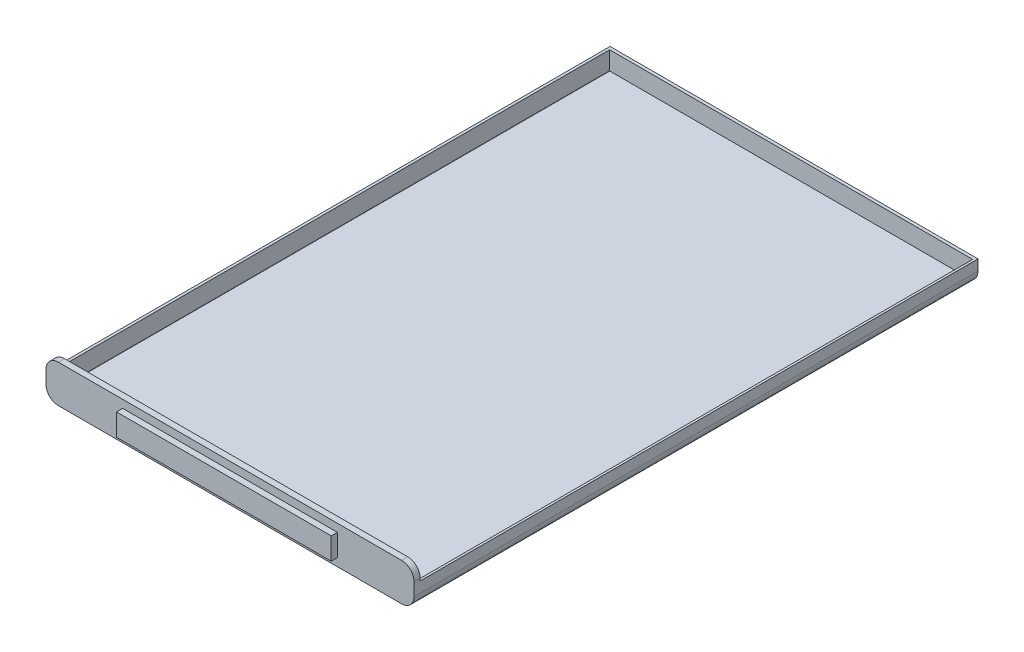
ISO-10303-21;
HEADER;
FILE_DESCRIPTION(('STEP AP214'),'2;1');
FILE_NAME('part.step','',(''),(''),'','','');
FILE_SCHEMA(('AUTOMOTIVE_DESIGN { 1 0 10303 214 1 1 1 1 }'));
ENDSEC;
DATA;
#1=APPLICATION_CONTEXT('core data for automotive mechanical design processes');
#2=APPLICATION_PROTOCOL_DEFINITION('international standard','automotive_design',2000,#1);
#3=PRODUCT_CONTEXT('',#1,'mechanical');
#4=PRODUCT('Part','Part','',(#3));
#5=PRODUCT_RELATED_PRODUCT_CATEGORY('part','',(#4));
#6=PRODUCT_DEFINITION_FORMATION('','',#4);
#7=PRODUCT_DEFINITION_CONTEXT('part definition',#1,'design');
#8=PRODUCT_DEFINITION('design','',#6,#7);
#9=PRODUCT_DEFINITION_SHAPE('','',#8);
#10=(LENGTH_UNIT() NAMED_UNIT(*) SI_UNIT(.MILLI.,.METRE.));
#11=(NAMED_UNIT(*) PLANE_ANGLE_UNIT() SI_UNIT($,.RADIAN.));
#12=(NAMED_UNIT(*) SI_UNIT($,.STERADIAN.) SOLID_ANGLE_UNIT());
#13=UNCERTAINTY_MEASURE_WITH_UNIT(LENGTH_MEASURE(1.E-05),#10,'distance_accuracy_value','');
#14=(GEOMETRIC_REPRESENTATION_CONTEXT(3) GLOBAL_UNCERTAINTY_ASSIGNED_CONTEXT((#13)) GLOBAL_UNIT_ASSIGNED_CONTEXT((#10,
#11,#12)) REPRESENTATION_CONTEXT('',''));
#15=CARTESIAN_POINT('',(0.,0.,0.));
#16=DIRECTION('',(0.,0.,1.));
#17=DIRECTION('',(1.,0.,0.));
#18=AXIS2_PLACEMENT_3D('',#15,#16,#17);
#19=CARTESIAN_POINT('',(0.,3.,0.));
#20=DIRECTION('',(0.,1.,0.));
#21=DIRECTION('',(0.,0.,1.));
#22=AXIS2_PLACEMENT_3D('',#19,#20,#21);
#23=PLANE('',#22);
#24=DIRECTION('',(0.,0.,1.));
#25=VECTOR('',#24,1.);
#26=CARTESIAN_POINT('',(31.3199642723198,3.,-48.7729826923923));
#27=LINE('',#26,#25);
#28=CARTESIAN_POINT('',(31.3199642723198,3.,-48.7729826923923));
#29=VERTEX_POINT('',#28);
#30=CARTESIAN_POINT('',(31.3199642723198,3.,42.2270173076076));
#31=VERTEX_POINT('',#30);
#32=EDGE_CURVE('E232',#29,#31,#27,.T.);
#33=ORIENTED_EDGE('',*,*,#32,.F.);
#34=DIRECTION('',(-1.,0.,0.));
#35=VECTOR('',#34,1.);
#36=CARTESIAN_POINT('',(31.4606330237268,3.,-48.7729826923923));
#37=LINE('',#36,#35);
#38=CARTESIAN_POINT('',(-28.6994599791727,3.,-48.7729826923923));
#39=VERTEX_POINT('',#38);
#40=EDGE_CURVE('E352',#29,#39,#37,.T.);
#41=ORIENTED_EDGE('',*,*,#40,.T.);
#42=DIRECTION('',(0.,0.,1.));
#43=VECTOR('',#42,1.);
#44=CARTESIAN_POINT('',(-28.6994599791727,3.,-48.7729826923923));
#45=LINE('',#44,#43);
#46=CARTESIAN_POINT('',(-28.6994599791727,3.,42.2270173076076));
#47=VERTEX_POINT('',#46);
#48=EDGE_CURVE('E235',#39,#47,#45,.T.);
#49=ORIENTED_EDGE('',*,*,#48,.T.);
#50=DIRECTION('',(-1.,0.,0.));
#51=VECTOR('',#50,1.);
#52=CARTESIAN_POINT('',(0.,3.,42.2270173076076));
#53=LINE('',#52,#51);
#54=CARTESIAN_POINT('',(-28.2719782062236,3.,42.2270173076076));
#55=VERTEX_POINT('',#54);
#56=EDGE_CURVE('E320',#55,#47,#53,.T.);
#57=ORIENTED_EDGE('',*,*,#56,.F.);
#58=DIRECTION('',(0.,0.,1.));
#59=VECTOR('',#58,1.);
#60=CARTESIAN_POINT('',(-28.2719782062236,3.,42.7270173076076));
#61=LINE('',#60,#59);
#62=CARTESIAN_POINT('',(-28.2719782062236,3.,-48.2729826923923));
#63=VERTEX_POINT('',#62);
#64=EDGE_CURVE('E379',#63,#55,#61,.T.);
#65=ORIENTED_EDGE('',*,*,#64,.F.);
#66=DIRECTION('',(-1.,0.,0.));
#67=VECTOR('',#66,1.);
#68=CARTESIAN_POINT('',(30.9606330237268,3.,-48.2729826923923));
#69=LINE('',#68,#67);
#70=CARTESIAN_POINT('',(30.9606330237268,3.,-48.2729826923923));
#71=VERTEX_POINT('',#70);
#72=EDGE_CURVE('E376',#71,#63,#69,.T.);
#73=ORIENTED_EDGE('',*,*,#72,.F.);
#74=DIRECTION('',(0.,0.,-1.));
#75=VECTOR('',#74,1.);
#76=CARTESIAN_POINT('',(30.9606330237268,3.,42.7270173076076));
#77=LINE('',#76,#75);
#78=CARTESIAN_POINT('',(30.9606330237268,3.,42.2270173076076));
#79=VERTEX_POINT('',#78);
#80=EDGE_CURVE('E373',#79,#71,#77,.T.);
#81=ORIENTED_EDGE('',*,*,#80,.F.);
#82=EDGE_CURVE('E324',#31,#79,#53,.T.);
#83=ORIENTED_EDGE('',*,*,#82,.F.);
#84=EDGE_LOOP('',(#33,#41,#49,#57,#65,#73,#81,#83));
#85=FACE_BOUND('',#84,.T.);
#86=ADVANCED_FACE('F39',(#85),#23,.T.);
#87=CARTESIAN_POINT('',(31.4606330237268,3.,-48.7729826923923));
#88=DIRECTION('',(0.,0.,1.));
#89=DIRECTION('',(1.,0.,0.));
#90=AXIS2_PLACEMENT_3D('',#87,#88,#89);
#91=PLANE('',#90);
#92=ORIENTED_EDGE('',*,*,#40,.F.);
#93=DIRECTION('',(0.,-1.,0.));
#94=VECTOR('',#93,1.);
#95=CARTESIAN_POINT('',(31.3199642723198,0.,-48.7729826923923));
#96=LINE('',#95,#94);
#97=CARTESIAN_POINT('',(31.3199642723198,1.26395360574872,-48.7729826923923));
#98=VERTEX_POINT('',#97);
#99=EDGE_CURVE('E215',#29,#98,#96,.T.);
#100=ORIENTED_EDGE('',*,*,#99,.T.);
#101=CARTESIAN_POINT('',(29.3199642723198,1.26395360574872,-48.7729826923923));
#102=DIRECTION('',(0.,0.,1.));
#103=DIRECTION('',(1.,0.,0.));
#104=AXIS2_PLACEMENT_3D('',#101,#102,#103);
#105=CIRCLE('',#104,2.);
#106=CARTESIAN_POINT('',(29.3199642723198,-0.736046394251282,-48.7729826923923));
#107=VERTEX_POINT('',#106);
#108=EDGE_CURVE('E190',#98,#107,#105,.F.);
#109=ORIENTED_EDGE('',*,*,#108,.T.);
#110=DIRECTION('',(-1.,0.,0.));
#111=VECTOR('',#110,1.);
#112=CARTESIAN_POINT('',(0.,-0.736046394251286,-48.7729826923923));
#113=LINE('',#112,#111);
#114=CARTESIAN_POINT('',(-26.6994599791727,-0.736046394251289,-48.7729826923923));
#115=VERTEX_POINT('',#114);
#116=EDGE_CURVE('E181',#107,#115,#113,.T.);
#117=ORIENTED_EDGE('',*,*,#116,.T.);
#118=CARTESIAN_POINT('',(-26.6994599791727,1.26395360574871,-48.7729826923923));
#119=DIRECTION('',(0.,0.,1.));
#120=DIRECTION('',(1.,0.,0.));
#121=AXIS2_PLACEMENT_3D('',#118,#119,#120);
#122=CIRCLE('',#121,2.);
#123=CARTESIAN_POINT('',(-28.6994599791727,1.26395360574871,-48.7729826923923));
#124=VERTEX_POINT('',#123);
#125=EDGE_CURVE('E194',#115,#124,#122,.F.);
#126=ORIENTED_EDGE('',*,*,#125,.T.);
#127=DIRECTION('',(0.,-1.,0.));
#128=VECTOR('',#127,1.);
#129=CARTESIAN_POINT('',(-28.6994599791727,0.,-48.7729826923923));
#130=LINE('',#129,#128);
#131=EDGE_CURVE('E200',#39,#124,#130,.T.);
#132=ORIENTED_EDGE('',*,*,#131,.F.);
#133=EDGE_LOOP('',(#92,#100,#109,#117,#126,#132));
#134=FACE_BOUND('',#133,.T.);
#135=ADVANCED_FACE('F41',(#134),#91,.F.);
#136=CARTESIAN_POINT('',(31.4606330237268,3.,43.2270173076076));
#137=DIRECTION('',(0.,0.,-1.));
#138=DIRECTION('',(-1.,0.,0.));
#139=AXIS2_PLACEMENT_3D('',#136,#137,#138);
#140=PLANE('',#139);
#141=DIRECTION('',(-1.,0.,0.));
#142=VECTOR('',#141,1.);
#143=CARTESIAN_POINT('',(18.8199642723198,4.12616271109401,43.2270173076076));
#144=LINE('',#143,#142);
#145=CARTESIAN_POINT('',(18.8199642723198,4.12616271109401,43.2270173076076));
#146=VERTEX_POINT('',#145);
#147=CARTESIAN_POINT('',(-16.1994599791727,4.12616271109401,43.2270173076076));
#148=VERTEX_POINT('',#147);
#149=EDGE_CURVE('E344',#146,#148,#144,.T.);
#150=ORIENTED_EDGE('',*,*,#149,.F.);
#151=DIRECTION('',(0.,-1.,0.));
#152=VECTOR('',#151,1.);
#153=CARTESIAN_POINT('',(18.8199642723198,4.12616271109401,43.2270173076076));
#154=LINE('',#153,#152);
#155=CARTESIAN_POINT('',(18.8199642723198,0.543482317681697,43.2270173076076));
#156=VERTEX_POINT('',#155);
#157=EDGE_CURVE('E48',#146,#156,#154,.T.);
#158=ORIENTED_EDGE('',*,*,#157,.T.);
#159=DIRECTION('',(-1.,0.,0.));
#160=VECTOR('',#159,1.);
#161=CARTESIAN_POINT('',(18.8199642723198,0.543482317681697,43.2270173076076));
#162=LINE('',#161,#160);
#163=CARTESIAN_POINT('',(-16.1994599791727,0.543482317681693,43.2270173076076));
#164=VERTEX_POINT('',#163);
#165=EDGE_CURVE('E332',#156,#164,#162,.T.);
#166=ORIENTED_EDGE('',*,*,#165,.T.);
#167=DIRECTION('',(0.,-1.,0.));
#168=VECTOR('',#167,1.);
#169=CARTESIAN_POINT('',(-16.1994599791727,4.12616271109401,43.2270173076076));
#170=LINE('',#169,#168);
#171=EDGE_CURVE('E348',#148,#164,#170,.T.);
#172=ORIENTED_EDGE('',*,*,#171,.F.);
#173=EDGE_LOOP('',(#150,#158,#166,#172));
#174=FACE_BOUND('',#173,.T.);
#175=CARTESIAN_POINT('',(29.3199642723198,1.26395360574872,43.2270173076076));
#176=DIRECTION('',(0.,0.,1.));
#177=DIRECTION('',(1.,0.,0.));
#178=AXIS2_PLACEMENT_3D('',#175,#176,#177);
#179=CIRCLE('',#178,2.);
#180=CARTESIAN_POINT('',(31.3199642723198,1.26395360574872,43.2270173076076));
#181=VERTEX_POINT('',#180);
#182=CARTESIAN_POINT('',(29.3199642723198,-0.736046394251282,43.2270173076076));
#183=VERTEX_POINT('',#182);
#184=EDGE_CURVE('E206',#181,#183,#179,.F.);
#185=ORIENTED_EDGE('',*,*,#184,.F.);
#186=DIRECTION('',(0.,-1.,0.));
#187=VECTOR('',#186,1.);
#188=CARTESIAN_POINT('',(31.3199642723198,3.40767973402638,43.2270173076076));
#189=LINE('',#188,#187);
#190=CARTESIAN_POINT('',(31.3199642723198,3.40767973402638,43.2270173076076));
#191=VERTEX_POINT('',#190);
#192=EDGE_CURVE('E291',#191,#181,#189,.T.);
#193=ORIENTED_EDGE('',*,*,#192,.F.);
#194=CARTESIAN_POINT('',(29.3199642723198,3.40767973402638,43.2270173076076));
#195=DIRECTION('',(0.,0.,-1.));
#196=DIRECTION('',(-1.,0.,0.));
#197=AXIS2_PLACEMENT_3D('',#194,#195,#196);
#198=CIRCLE('',#197,2.);
#199=CARTESIAN_POINT('',(29.3199642723198,5.40767973402638,43.2270173076076));
#200=VERTEX_POINT('',#199);
#201=EDGE_CURVE('E257',#200,#191,#198,.T.);
#202=ORIENTED_EDGE('',*,*,#201,.F.);
#203=DIRECTION('',(-1.,0.,0.));
#204=VECTOR('',#203,1.);
#205=CARTESIAN_POINT('',(29.3199642723198,5.40767973402638,43.2270173076076));
#206=LINE('',#205,#204);
#207=CARTESIAN_POINT('',(-26.6994599791727,5.40767973402637,43.2270173076076));
#208=VERTEX_POINT('',#207);
#209=EDGE_CURVE('E263',#200,#208,#206,.T.);
#210=ORIENTED_EDGE('',*,*,#209,.T.);
#211=CARTESIAN_POINT('',(-26.6994599791727,3.40767973402637,43.2270173076076));
#212=DIRECTION('',(0.,0.,1.));
#213=DIRECTION('',(1.,0.,0.));
#214=AXIS2_PLACEMENT_3D('',#211,#212,#213);
#215=CIRCLE('',#214,2.);
#216=CARTESIAN_POINT('',(-28.6994599791727,3.40767973402637,43.2270173076076));
#217=VERTEX_POINT('',#216);
#218=EDGE_CURVE('E297',#208,#217,#215,.T.);
#219=ORIENTED_EDGE('',*,*,#218,.T.);
#220=DIRECTION('',(0.,-1.,0.));
#221=VECTOR('',#220,1.);
#222=CARTESIAN_POINT('',(-28.6994599791727,3.40767973402637,43.2270173076076));
#223=LINE('',#222,#221);
#224=CARTESIAN_POINT('',(-28.6994599791727,1.26395360574871,43.2270173076076));
#225=VERTEX_POINT('',#224);
#226=EDGE_CURVE('E294',#217,#225,#223,.T.);
#227=ORIENTED_EDGE('',*,*,#226,.T.);
#228=CARTESIAN_POINT('',(-26.6994599791727,1.26395360574871,43.2270173076076));
#229=DIRECTION('',(0.,0.,1.));
#230=DIRECTION('',(1.,0.,0.));
#231=AXIS2_PLACEMENT_3D('',#228,#229,#230);
#232=CIRCLE('',#231,2.);
#233=CARTESIAN_POINT('',(-26.6994599791727,-0.736046394251289,43.2270173076076));
#234=VERTEX_POINT('',#233);
#235=EDGE_CURVE('E210',#234,#225,#232,.F.);
#236=ORIENTED_EDGE('',*,*,#235,.F.);
#237=DIRECTION('',(-1.,0.,0.));
#238=VECTOR('',#237,1.);
#239=CARTESIAN_POINT('',(0.,-0.736046394251286,43.2270173076076));
#240=LINE('',#239,#238);
#241=EDGE_CURVE('E184',#183,#234,#240,.T.);
#242=ORIENTED_EDGE('',*,*,#241,.F.);
#243=EDGE_LOOP('',(#185,#193,#202,#210,#219,#227,#236,#242));
#244=FACE_BOUND('',#243,.T.);
#245=ADVANCED_FACE('F448',(#174,#244),#140,.F.);
#246=CARTESIAN_POINT('',(30.9606330237268,3.,-48.2729826923923));
#247=DIRECTION('',(0.,0.,1.));
#248=DIRECTION('',(1.,0.,0.));
#249=AXIS2_PLACEMENT_3D('',#246,#247,#248);
#250=PLANE('',#249);
#251=CARTESIAN_POINT('',(29.3199642723198,1.26395360574872,-48.2729826923923));
#252=DIRECTION('',(0.,0.,1.));
#253=DIRECTION('',(1.,0.,0.));
#254=AXIS2_PLACEMENT_3D('',#251,#252,#253);
#255=CIRCLE('',#254,2.);
#256=CARTESIAN_POINT('',(30.9606330237268,0.120185251510636,-48.2729826923923));
#257=VERTEX_POINT('',#256);
#258=CARTESIAN_POINT('',(30.8699388793747,0.,-48.2729826923923));
#259=VERTEX_POINT('',#258);
#260=EDGE_CURVE('E254',#257,#259,#255,.F.);
#261=ORIENTED_EDGE('',*,*,#260,.F.);
#262=DIRECTION('',(0.,-1.,0.));
#263=VECTOR('',#262,1.);
#264=CARTESIAN_POINT('',(30.9606330237268,3.,-48.2729826923923));
#265=LINE('',#264,#263);
#266=EDGE_CURVE('E390',#71,#257,#265,.T.);
#267=ORIENTED_EDGE('',*,*,#266,.F.);
#268=ORIENTED_EDGE('',*,*,#72,.T.);
#269=DIRECTION('',(0.,-1.,0.));
#270=VECTOR('',#269,1.);
#271=CARTESIAN_POINT('',(-28.2719782062236,3.,-48.2729826923923));
#272=LINE('',#271,#270);
#273=CARTESIAN_POINT('',(-28.2719782062236,0.0281597614555718,-48.2729826923923));
#274=VERTEX_POINT('',#273);
#275=EDGE_CURVE('E383',#63,#274,#272,.T.);
#276=ORIENTED_EDGE('',*,*,#275,.T.);
#277=CARTESIAN_POINT('',(-26.6994599791727,1.26395360574871,-48.2729826923923));
#278=DIRECTION('',(0.,0.,1.));
#279=DIRECTION('',(1.,0.,0.));
#280=AXIS2_PLACEMENT_3D('',#277,#278,#279);
#281=CIRCLE('',#280,2.);
#282=CARTESIAN_POINT('',(-28.2494345862275,0.,-48.2729826923923));
#283=VERTEX_POINT('',#282);
#284=EDGE_CURVE('E227',#283,#274,#281,.F.);
#285=ORIENTED_EDGE('',*,*,#284,.F.);
#286=DIRECTION('',(-1.,0.,0.));
#287=VECTOR('',#286,1.);
#288=CARTESIAN_POINT('',(30.9606330237268,0.,-48.2729826923923));
#289=LINE('',#288,#287);
#290=EDGE_CURVE('E372',#259,#283,#289,.T.);
#291=ORIENTED_EDGE('',*,*,#290,.F.);
#292=EDGE_LOOP('',(#261,#267,#268,#276,#285,#291));
#293=FACE_BOUND('',#292,.T.);
#294=ADVANCED_FACE('F439',(#293),#250,.T.);
#295=CARTESIAN_POINT('',(30.9606330237268,3.,42.7270173076076));
#296=DIRECTION('',(-1.,0.,0.));
#297=DIRECTION('',(0.,0.,1.));
#298=AXIS2_PLACEMENT_3D('',#295,#296,#297);
#299=PLANE('',#298);
#300=DIRECTION('',(0.,0.,1.));
#301=VECTOR('',#300,1.);
#302=CARTESIAN_POINT('',(30.9606330237268,0.120185251510636,-48.7729826923923));
#303=LINE('',#302,#301);
#304=CARTESIAN_POINT('',(30.9606330237268,0.120185251510636,42.2270173076076));
#305=VERTEX_POINT('',#304);
#306=EDGE_CURVE('E55',#305,#257,#303,.F.);
#307=ORIENTED_EDGE('',*,*,#306,.F.);
#308=DIRECTION('',(0.,-1.,0.));
#309=VECTOR('',#308,1.);
#310=CARTESIAN_POINT('',(30.9606330237268,3.,42.2270173076076));
#311=LINE('',#310,#309);
#312=EDGE_CURVE('E62',#79,#305,#311,.T.);
#313=ORIENTED_EDGE('',*,*,#312,.F.);
#314=ORIENTED_EDGE('',*,*,#80,.T.);
#315=ORIENTED_EDGE('',*,*,#266,.T.);
#316=EDGE_LOOP('',(#307,#313,#314,#315));
#317=FACE_BOUND('',#316,.T.);
#318=ADVANCED_FACE('F440',(#317),#299,.T.);
#319=CARTESIAN_POINT('',(-28.2719782062236,3.,42.7270173076076));
#320=DIRECTION('',(1.,0.,0.));
#321=DIRECTION('',(0.,0.,-1.));
#322=AXIS2_PLACEMENT_3D('',#319,#320,#321);
#323=PLANE('',#322);
#324=DIRECTION('',(0.,0.,1.));
#325=VECTOR('',#324,1.);
#326=CARTESIAN_POINT('',(-28.2719782062236,0.0281597614555718,-48.7729826923923));
#327=LINE('',#326,#325);
#328=CARTESIAN_POINT('',(-28.2719782062236,0.0281597614555718,42.2270173076076));
#329=VERTEX_POINT('',#328);
#330=EDGE_CURVE('E243',#274,#329,#327,.T.);
#331=ORIENTED_EDGE('',*,*,#330,.F.);
#332=ORIENTED_EDGE('',*,*,#275,.F.);
#333=ORIENTED_EDGE('',*,*,#64,.T.);
#334=DIRECTION('',(0.,1.,0.));
#335=VECTOR('',#334,1.);
#336=CARTESIAN_POINT('',(-28.2719782062236,3.,42.2270173076076));
#337=LINE('',#336,#335);
#338=EDGE_CURVE('E316',#329,#55,#337,.T.);
#339=ORIENTED_EDGE('',*,*,#338,.F.);
#340=EDGE_LOOP('',(#331,#332,#333,#339));
#341=FACE_BOUND('',#340,.T.);
#342=ADVANCED_FACE('F435',(#341),#323,.T.);
#343=CARTESIAN_POINT('',(0.,0.,0.));
#344=DIRECTION('',(0.,-1.,0.));
#345=DIRECTION('',(0.,0.,-1.));
#346=AXIS2_PLACEMENT_3D('',#343,#344,#345);
#347=PLANE('',#346);
#348=DIRECTION('',(1.,0.,0.));
#349=VECTOR('',#348,1.);
#350=CARTESIAN_POINT('',(0.,0.,42.2270173076076));
#351=LINE('',#350,#349);
#352=CARTESIAN_POINT('',(-28.2494345862275,0.,42.2270173076076));
#353=VERTEX_POINT('',#352);
#354=CARTESIAN_POINT('',(30.8699388793747,0.,42.2270173076076));
#355=VERTEX_POINT('',#354);
#356=EDGE_CURVE('E11',#353,#355,#351,.T.);
#357=ORIENTED_EDGE('',*,*,#356,.T.);
#358=DIRECTION('',(0.,0.,1.));
#359=VECTOR('',#358,1.);
#360=CARTESIAN_POINT('',(30.8699388793747,0.,-48.7729826923923));
#361=LINE('',#360,#359);
#362=EDGE_CURVE('E246',#355,#259,#361,.F.);
#363=ORIENTED_EDGE('',*,*,#362,.T.);
#364=ORIENTED_EDGE('',*,*,#290,.T.);
#365=DIRECTION('',(0.,0.,1.));
#366=VECTOR('',#365,1.);
#367=CARTESIAN_POINT('',(-28.2494345862275,0.,-48.7729826923923));
#368=LINE('',#367,#366);
#369=EDGE_CURVE('E240',#283,#353,#368,.T.);
#370=ORIENTED_EDGE('',*,*,#369,.T.);
#371=EDGE_LOOP('',(#357,#363,#364,#370));
#372=FACE_BOUND('',#371,.T.);
#373=ADVANCED_FACE('F427',(#372),#347,.F.);
#374=CARTESIAN_POINT('',(18.8199642723198,4.12616271109401,44.2270173076076));
#375=DIRECTION('',(0.,-1.,0.));
#376=DIRECTION('',(1.,0.,0.));
#377=AXIS2_PLACEMENT_3D('',#374,#375,#376);
#378=PLANE('',#377);
#379=ORIENTED_EDGE('',*,*,#149,.T.);
#380=DIRECTION('',(0.,0.,-1.));
#381=VECTOR('',#380,1.);
#382=CARTESIAN_POINT('',(-16.1994599791727,4.12616271109401,44.2270173076076));
#383=LINE('',#382,#381);
#384=CARTESIAN_POINT('',(-16.1994599791727,4.12616271109401,44.2270173076076));
#385=VERTEX_POINT('',#384);
#386=EDGE_CURVE('E368',#385,#148,#383,.T.);
#387=ORIENTED_EDGE('',*,*,#386,.F.);
#388=DIRECTION('',(-1.,0.,0.));
#389=VECTOR('',#388,1.);
#390=CARTESIAN_POINT('',(18.8199642723198,4.12616271109401,44.2270173076076));
#391=LINE('',#390,#389);
#392=CARTESIAN_POINT('',(18.8199642723198,4.12616271109401,44.2270173076076));
#393=VERTEX_POINT('',#392);
#394=EDGE_CURVE('E327',#393,#385,#391,.T.);
#395=ORIENTED_EDGE('',*,*,#394,.F.);
#396=DIRECTION('',(0.,0.,-1.));
#397=VECTOR('',#396,1.);
#398=CARTESIAN_POINT('',(18.8199642723198,4.12616271109401,44.2270173076076));
#399=LINE('',#398,#397);
#400=EDGE_CURVE('E343',#393,#146,#399,.T.);
#401=ORIENTED_EDGE('',*,*,#400,.T.);
#402=EDGE_LOOP('',(#379,#387,#395,#401));
#403=FACE_BOUND('',#402,.T.);
#404=ADVANCED_FACE('F489',(#403),#378,.F.);
#405=CARTESIAN_POINT('',(-16.1994599791727,4.12616271109401,44.2270173076076));
#406=DIRECTION('',(1.,0.,0.));
#407=DIRECTION('',(0.,1.,0.));
#408=AXIS2_PLACEMENT_3D('',#405,#406,#407);
#409=PLANE('',#408);
#410=ORIENTED_EDGE('',*,*,#386,.T.);
#411=ORIENTED_EDGE('',*,*,#171,.T.);
#412=DIRECTION('',(0.,0.,-1.));
#413=VECTOR('',#412,1.);
#414=CARTESIAN_POINT('',(-16.1994599791727,0.543482317681693,44.2270173076076));
#415=LINE('',#414,#413);
#416=CARTESIAN_POINT('',(-16.1994599791727,0.543482317681693,44.2270173076076));
#417=VERTEX_POINT('',#416);
#418=EDGE_CURVE('E364',#417,#164,#415,.T.);
#419=ORIENTED_EDGE('',*,*,#418,.F.);
#420=DIRECTION('',(0.,-1.,0.));
#421=VECTOR('',#420,1.);
#422=CARTESIAN_POINT('',(-16.1994599791727,4.12616271109401,44.2270173076076));
#423=LINE('',#422,#421);
#424=EDGE_CURVE('E331',#385,#417,#423,.T.);
#425=ORIENTED_EDGE('',*,*,#424,.F.);
#426=EDGE_LOOP('',(#410,#411,#419,#425));
#427=FACE_BOUND('',#426,.T.);
#428=ADVANCED_FACE('F485',(#427),#409,.F.);
#429=CARTESIAN_POINT('',(18.8199642723198,0.543482317681697,44.2270173076076));
#430=DIRECTION('',(0.,-1.,0.));
#431=DIRECTION('',(1.,0.,0.));
#432=AXIS2_PLACEMENT_3D('',#429,#430,#431);
#433=PLANE('',#432);
#434=ORIENTED_EDGE('',*,*,#165,.F.);
#435=DIRECTION('',(0.,0.,-1.));
#436=VECTOR('',#435,1.);
#437=CARTESIAN_POINT('',(18.8199642723198,0.543482317681697,44.2270173076076));
#438=LINE('',#437,#436);
#439=CARTESIAN_POINT('',(18.8199642723198,0.543482317681697,44.2270173076076));
#440=VERTEX_POINT('',#439);
#441=EDGE_CURVE('E360',#440,#156,#438,.T.);
#442=ORIENTED_EDGE('',*,*,#441,.F.);
#443=DIRECTION('',(-1.,0.,0.));
#444=VECTOR('',#443,1.);
#445=CARTESIAN_POINT('',(18.8199642723198,0.543482317681697,44.2270173076076));
#446=LINE('',#445,#444);
#447=EDGE_CURVE('E335',#440,#417,#446,.T.);
#448=ORIENTED_EDGE('',*,*,#447,.T.);
#449=ORIENTED_EDGE('',*,*,#418,.T.);
#450=EDGE_LOOP('',(#434,#442,#448,#449));
#451=FACE_BOUND('',#450,.T.);
#452=ADVANCED_FACE('F481',(#451),#433,.T.);
#453=CARTESIAN_POINT('',(18.8199642723198,4.12616271109401,44.2270173076076));
#454=DIRECTION('',(1.,0.,0.));
#455=DIRECTION('',(0.,0.,-1.));
#456=AXIS2_PLACEMENT_3D('',#453,#454,#455);
#457=PLANE('',#456);
#458=ORIENTED_EDGE('',*,*,#157,.F.);
#459=ORIENTED_EDGE('',*,*,#400,.F.);
#460=DIRECTION('',(0.,-1.,0.));
#461=VECTOR('',#460,1.);
#462=CARTESIAN_POINT('',(18.8199642723198,4.12616271109401,44.2270173076076));
#463=LINE('',#462,#461);
#464=EDGE_CURVE('E339',#393,#440,#463,.T.);
#465=ORIENTED_EDGE('',*,*,#464,.T.);
#466=ORIENTED_EDGE('',*,*,#441,.T.);
#467=EDGE_LOOP('',(#458,#459,#465,#466));
#468=FACE_BOUND('',#467,.T.);
#469=ADVANCED_FACE('F477',(#468),#457,.T.);
#470=CARTESIAN_POINT('',(0.,0.,44.2270173076076));
#471=DIRECTION('',(0.,0.,1.));
#472=DIRECTION('',(1.,0.,0.));
#473=AXIS2_PLACEMENT_3D('',#470,#471,#472);
#474=PLANE('',#473);
#475=ORIENTED_EDGE('',*,*,#394,.T.);
#476=ORIENTED_EDGE('',*,*,#424,.T.);
#477=ORIENTED_EDGE('',*,*,#447,.F.);
#478=ORIENTED_EDGE('',*,*,#464,.F.);
#479=EDGE_LOOP('',(#475,#476,#477,#478));
#480=FACE_BOUND('',#479,.T.);
#481=ADVANCED_FACE('F474',(#480),#474,.T.);
#482=CARTESIAN_POINT('',(29.3199642723198,3.40767973402638,42.2270173076076));
#483=DIRECTION('',(0.,0.,-1.));
#484=DIRECTION('',(-1.,0.,0.));
#485=AXIS2_PLACEMENT_3D('',#482,#483,#484);
#486=PLANE('',#485);
#487=DIRECTION('',(0.,-1.,0.));
#488=VECTOR('',#487,1.);
#489=CARTESIAN_POINT('',(31.3199642723198,3.40767973402638,42.2270173076076));
#490=LINE('',#489,#488);
#491=CARTESIAN_POINT('',(31.3199642723198,3.40767973402638,42.2270173076076));
#492=VERTEX_POINT('',#491);
#493=EDGE_CURVE('E262',#492,#31,#490,.T.);
#494=ORIENTED_EDGE('',*,*,#493,.T.);
#495=ORIENTED_EDGE('',*,*,#82,.T.);
#496=ORIENTED_EDGE('',*,*,#312,.T.);
#497=CARTESIAN_POINT('',(29.3199642723198,1.26395360574872,42.2270173076076));
#498=DIRECTION('',(0.,0.,-1.));
#499=DIRECTION('',(-1.,0.,0.));
#500=AXIS2_PLACEMENT_3D('',#497,#498,#499);
#501=CIRCLE('',#500,2.);
#502=EDGE_CURVE('E267',#305,#355,#501,.T.);
#503=ORIENTED_EDGE('',*,*,#502,.T.);
#504=ORIENTED_EDGE('',*,*,#356,.F.);
#505=CARTESIAN_POINT('',(-26.6994599791727,1.26395360574871,42.2270173076076));
#506=DIRECTION('',(0.,0.,-1.));
#507=DIRECTION('',(-1.,0.,0.));
#508=AXIS2_PLACEMENT_3D('',#505,#506,#507);
#509=CIRCLE('',#508,2.);
#510=EDGE_CURVE('E271',#353,#329,#509,.T.);
#511=ORIENTED_EDGE('',*,*,#510,.T.);
#512=ORIENTED_EDGE('',*,*,#338,.T.);
#513=ORIENTED_EDGE('',*,*,#56,.T.);
#514=DIRECTION('',(0.,-1.,0.));
#515=VECTOR('',#514,1.);
#516=CARTESIAN_POINT('',(-28.6994599791727,3.40767973402637,42.2270173076076));
#517=LINE('',#516,#515);
#518=CARTESIAN_POINT('',(-28.6994599791727,3.40767973402637,42.2270173076076));
#519=VERTEX_POINT('',#518);
#520=EDGE_CURVE('E275',#519,#47,#517,.T.);
#521=ORIENTED_EDGE('',*,*,#520,.F.);
#522=CARTESIAN_POINT('',(-26.6994599791727,3.40767973402637,42.2270173076076));
#523=DIRECTION('',(0.,0.,1.));
#524=DIRECTION('',(1.,0.,0.));
#525=AXIS2_PLACEMENT_3D('',#522,#523,#524);
#526=CIRCLE('',#525,2.);
#527=CARTESIAN_POINT('',(-26.6994599791727,5.40767973402637,42.2270173076076));
#528=VERTEX_POINT('',#527);
#529=EDGE_CURVE('E279',#528,#519,#526,.T.);
#530=ORIENTED_EDGE('',*,*,#529,.F.);
#531=DIRECTION('',(-1.,0.,0.));
#532=VECTOR('',#531,1.);
#533=CARTESIAN_POINT('',(29.3199642723198,5.40767973402638,42.2270173076076));
#534=LINE('',#533,#532);
#535=CARTESIAN_POINT('',(29.3199642723198,5.40767973402638,42.2270173076076));
#536=VERTEX_POINT('',#535);
#537=EDGE_CURVE('E283',#536,#528,#534,.T.);
#538=ORIENTED_EDGE('',*,*,#537,.F.);
#539=CARTESIAN_POINT('',(29.3199642723198,3.40767973402638,42.2270173076076));
#540=DIRECTION('',(0.,0.,-1.));
#541=DIRECTION('',(-1.,0.,0.));
#542=AXIS2_PLACEMENT_3D('',#539,#540,#541);
#543=CIRCLE('',#542,2.);
#544=EDGE_CURVE('E258',#536,#492,#543,.T.);
#545=ORIENTED_EDGE('',*,*,#544,.T.);
#546=EDGE_LOOP('',(#494,#495,#496,#503,#504,#511,#512,#513,#521,#530,#538,#545));
#547=FACE_BOUND('',#546,.T.);
#548=ADVANCED_FACE('F404',(#547),#486,.T.);
#549=CARTESIAN_POINT('',(29.3199642723198,3.40767973402638,42.2270173076076));
#550=DIRECTION('',(0.,0.,1.));
#551=DIRECTION('',(1.,0.,0.));
#552=AXIS2_PLACEMENT_3D('',#549,#550,#551);
#553=CYLINDRICAL_SURFACE('',#552,2.);
#554=ORIENTED_EDGE('',*,*,#201,.T.);
#555=DIRECTION('',(0.,0.,1.));
#556=VECTOR('',#555,1.);
#557=CARTESIAN_POINT('',(31.3199642723198,3.40767973402638,42.2270173076076));
#558=LINE('',#557,#556);
#559=EDGE_CURVE('E312',#492,#191,#558,.T.);
#560=ORIENTED_EDGE('',*,*,#559,.F.);
#561=ORIENTED_EDGE('',*,*,#544,.F.);
#562=DIRECTION('',(0.,0.,1.));
#563=VECTOR('',#562,1.);
#564=CARTESIAN_POINT('',(29.3199642723198,5.40767973402638,42.2270173076076));
#565=LINE('',#564,#563);
#566=EDGE_CURVE('E287',#536,#200,#565,.T.);
#567=ORIENTED_EDGE('',*,*,#566,.T.);
#568=EDGE_LOOP('',(#554,#560,#561,#567));
#569=FACE_BOUND('',#568,.T.);
#570=ADVANCED_FACE('F416',(#569),#553,.T.);
#571=CARTESIAN_POINT('',(31.3199642723198,3.40767973402638,42.2270173076076));
#572=DIRECTION('',(-1.,0.,0.));
#573=DIRECTION('',(0.,0.,1.));
#574=AXIS2_PLACEMENT_3D('',#571,#572,#573);
#575=PLANE('',#574);
#576=ORIENTED_EDGE('',*,*,#192,.T.);
#577=DIRECTION('',(0.,0.,1.));
#578=VECTOR('',#577,1.);
#579=CARTESIAN_POINT('',(31.3199642723198,1.26395360574872,-48.7729826923923));
#580=LINE('',#579,#578);
#581=EDGE_CURVE('E228',#98,#181,#580,.T.);
#582=ORIENTED_EDGE('',*,*,#581,.F.);
#583=ORIENTED_EDGE('',*,*,#99,.F.);
#584=ORIENTED_EDGE('',*,*,#32,.T.);
#585=ORIENTED_EDGE('',*,*,#493,.F.);
#586=ORIENTED_EDGE('',*,*,#559,.T.);
#587=EDGE_LOOP('',(#576,#582,#583,#584,#585,#586));
#588=FACE_BOUND('',#587,.T.);
#589=ADVANCED_FACE('F419',(#588),#575,.F.);
#590=CARTESIAN_POINT('',(29.3199642723198,1.26395360574872,42.2270173076076));
#591=DIRECTION('',(0.,0.,1.));
#592=DIRECTION('',(1.,0.,0.));
#593=AXIS2_PLACEMENT_3D('',#590,#591,#592);
#594=CYLINDRICAL_SURFACE('',#593,2.);
#595=ORIENTED_EDGE('',*,*,#502,.F.);
#596=ORIENTED_EDGE('',*,*,#306,.T.);
#597=ORIENTED_EDGE('',*,*,#260,.T.);
#598=ORIENTED_EDGE('',*,*,#362,.F.);
#599=EDGE_LOOP('',(#595,#596,#597,#598));
#600=FACE_BOUND('',#599,.T.);
#601=ORIENTED_EDGE('',*,*,#184,.T.);
#602=DIRECTION('',(0.,0.,1.));
#603=VECTOR('',#602,1.);
#604=CARTESIAN_POINT('',(29.3199642723198,-0.736046394251282,-48.7729826923923));
#605=LINE('',#604,#603);
#606=EDGE_CURVE('E224',#107,#183,#605,.T.);
#607=ORIENTED_EDGE('',*,*,#606,.F.);
#608=ORIENTED_EDGE('',*,*,#108,.F.);
#609=ORIENTED_EDGE('',*,*,#581,.T.);
#610=EDGE_LOOP('',(#601,#607,#608,#609));
#611=FACE_BOUND('',#610,.T.);
#612=ADVANCED_FACE('F423',(#600,#611),#594,.T.);
#613=CARTESIAN_POINT('',(-26.6994599791727,1.26395360574871,42.2270173076076));
#614=DIRECTION('',(0.,0.,1.));
#615=DIRECTION('',(1.,0.,0.));
#616=AXIS2_PLACEMENT_3D('',#613,#614,#615);
#617=CYLINDRICAL_SURFACE('',#616,2.);
#618=ORIENTED_EDGE('',*,*,#330,.T.);
#619=ORIENTED_EDGE('',*,*,#510,.F.);
#620=ORIENTED_EDGE('',*,*,#369,.F.);
#621=ORIENTED_EDGE('',*,*,#284,.T.);
#622=EDGE_LOOP('',(#618,#619,#620,#621));
#623=FACE_BOUND('',#622,.T.);
#624=ORIENTED_EDGE('',*,*,#235,.T.);
#625=DIRECTION('',(0.,0.,1.));
#626=VECTOR('',#625,1.);
#627=CARTESIAN_POINT('',(-28.6994599791727,1.26395360574871,-48.7729826923923));
#628=LINE('',#627,#626);
#629=EDGE_CURVE('E189',#124,#225,#628,.T.);
#630=ORIENTED_EDGE('',*,*,#629,.F.);
#631=ORIENTED_EDGE('',*,*,#125,.F.);
#632=DIRECTION('',(0.,0.,1.));
#633=VECTOR('',#632,1.);
#634=CARTESIAN_POINT('',(-26.6994599791727,-0.736046394251289,-48.7729826923923));
#635=LINE('',#634,#633);
#636=EDGE_CURVE('E177',#115,#234,#635,.T.);
#637=ORIENTED_EDGE('',*,*,#636,.T.);
#638=EDGE_LOOP('',(#624,#630,#631,#637));
#639=FACE_BOUND('',#638,.T.);
#640=ADVANCED_FACE('F195',(#623,#639),#617,.T.);
#641=CARTESIAN_POINT('',(-28.6994599791727,3.40767973402637,42.2270173076076));
#642=DIRECTION('',(-1.,0.,0.));
#643=DIRECTION('',(0.,0.,1.));
#644=AXIS2_PLACEMENT_3D('',#641,#642,#643);
#645=PLANE('',#644);
#646=ORIENTED_EDGE('',*,*,#520,.T.);
#647=ORIENTED_EDGE('',*,*,#48,.F.);
#648=ORIENTED_EDGE('',*,*,#131,.T.);
#649=ORIENTED_EDGE('',*,*,#629,.T.);
#650=ORIENTED_EDGE('',*,*,#226,.F.);
#651=DIRECTION('',(0.,0.,1.));
#652=VECTOR('',#651,1.);
#653=CARTESIAN_POINT('',(-28.6994599791727,3.40767973402637,42.2270173076076));
#654=LINE('',#653,#652);
#655=EDGE_CURVE('E309',#519,#217,#654,.T.);
#656=ORIENTED_EDGE('',*,*,#655,.F.);
#657=EDGE_LOOP('',(#646,#647,#648,#649,#650,#656));
#658=FACE_BOUND('',#657,.T.);
#659=ADVANCED_FACE('F399',(#658),#645,.T.);
#660=CARTESIAN_POINT('',(-26.6994599791727,3.40767973402637,42.2270173076076));
#661=DIRECTION('',(0.,0.,1.));
#662=DIRECTION('',(1.,0.,0.));
#663=AXIS2_PLACEMENT_3D('',#660,#661,#662);
#664=CYLINDRICAL_SURFACE('',#663,2.);
#665=ORIENTED_EDGE('',*,*,#218,.F.);
#666=DIRECTION('',(0.,0.,1.));
#667=VECTOR('',#666,1.);
#668=CARTESIAN_POINT('',(-26.6994599791727,5.40767973402637,42.2270173076076));
#669=LINE('',#668,#667);
#670=EDGE_CURVE('E306',#528,#208,#669,.T.);
#671=ORIENTED_EDGE('',*,*,#670,.F.);
#672=ORIENTED_EDGE('',*,*,#529,.T.);
#673=ORIENTED_EDGE('',*,*,#655,.T.);
#674=EDGE_LOOP('',(#665,#671,#672,#673));
#675=FACE_BOUND('',#674,.T.);
#676=ADVANCED_FACE('F408',(#675),#664,.T.);
#677=CARTESIAN_POINT('',(29.3199642723198,5.40767973402638,42.2270173076076));
#678=DIRECTION('',(0.,1.,0.));
#679=DIRECTION('',(-1.,0.,0.));
#680=AXIS2_PLACEMENT_3D('',#677,#678,#679);
#681=PLANE('',#680);
#682=ORIENTED_EDGE('',*,*,#209,.F.);
#683=ORIENTED_EDGE('',*,*,#566,.F.);
#684=ORIENTED_EDGE('',*,*,#537,.T.);
#685=ORIENTED_EDGE('',*,*,#670,.T.);
#686=EDGE_LOOP('',(#682,#683,#684,#685));
#687=FACE_BOUND('',#686,.T.);
#688=ADVANCED_FACE('F411',(#687),#681,.T.);
#689=CARTESIAN_POINT('',(0.,-0.736046394251286,-48.7729826923923));
#690=DIRECTION('',(0.,1.,0.));
#691=DIRECTION('',(-1.,0.,0.));
#692=AXIS2_PLACEMENT_3D('',#689,#690,#691);
#693=PLANE('',#692);
#694=ORIENTED_EDGE('',*,*,#241,.T.);
#695=ORIENTED_EDGE('',*,*,#636,.F.);
#696=ORIENTED_EDGE('',*,*,#116,.F.);
#697=ORIENTED_EDGE('',*,*,#606,.T.);
#698=EDGE_LOOP('',(#694,#695,#696,#697));
#699=FACE_BOUND('',#698,.T.);
#700=ADVANCED_FACE('F179',(#699),#693,.F.);
#701=CLOSED_SHELL('',(#86,#135,#245,#294,#318,#342,#373,#404,#428,#452,#469,#481,#548,#570,#589,
#612,#640,#659,#676,#688,#700));
#702=MANIFOLD_SOLID_BREP('B2',#701);
#703=ADVANCED_BREP_SHAPE_REPRESENTATION('',(#18,#702),#14);
#704=SHAPE_DEFINITION_REPRESENTATION(#9,#703);
ENDSEC;
END-ISO-10303-21;
